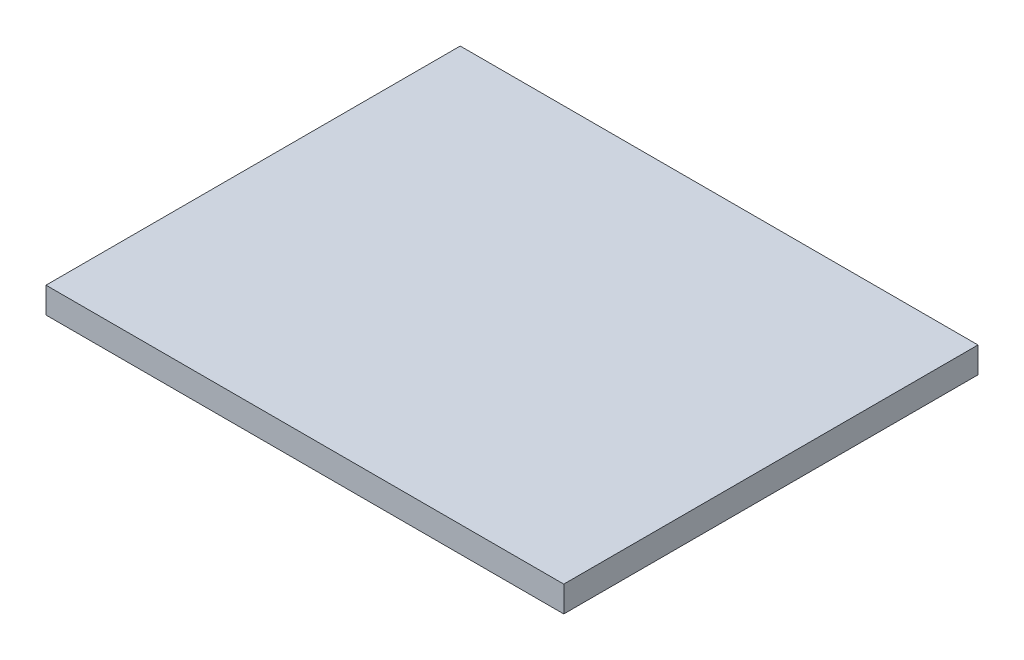
ISO-10303-21;
HEADER;
FILE_DESCRIPTION(('STEP AP214'),'2;1');
FILE_NAME('part.step','',(''),(''),'','','');
FILE_SCHEMA(('AUTOMOTIVE_DESIGN { 1 0 10303 214 1 1 1 1 }'));
ENDSEC;
DATA;
#1=APPLICATION_CONTEXT('core data for automotive mechanical design processes');
#2=APPLICATION_PROTOCOL_DEFINITION('international standard','automotive_design',2000,#1);
#3=PRODUCT_CONTEXT('',#1,'mechanical');
#4=PRODUCT('Part','Part','',(#3));
#5=PRODUCT_RELATED_PRODUCT_CATEGORY('part','',(#4));
#6=PRODUCT_DEFINITION_FORMATION('','',#4);
#7=PRODUCT_DEFINITION_CONTEXT('part definition',#1,'design');
#8=PRODUCT_DEFINITION('design','',#6,#7);
#9=PRODUCT_DEFINITION_SHAPE('','',#8);
#10=(LENGTH_UNIT() NAMED_UNIT(*) SI_UNIT(.MILLI.,.METRE.));
#11=(NAMED_UNIT(*) PLANE_ANGLE_UNIT() SI_UNIT($,.RADIAN.));
#12=(NAMED_UNIT(*) SI_UNIT($,.STERADIAN.) SOLID_ANGLE_UNIT());
#13=UNCERTAINTY_MEASURE_WITH_UNIT(LENGTH_MEASURE(1.E-05),#10,'distance_accuracy_value','');
#14=(GEOMETRIC_REPRESENTATION_CONTEXT(3) GLOBAL_UNCERTAINTY_ASSIGNED_CONTEXT((#13)) GLOBAL_UNIT_ASSIGNED_CONTEXT((#10,
#11,#12)) REPRESENTATION_CONTEXT('',''));
#15=CARTESIAN_POINT('',(0.,0.,0.));
#16=DIRECTION('',(0.,0.,1.));
#17=DIRECTION('',(1.,0.,0.));
#18=AXIS2_PLACEMENT_3D('',#15,#16,#17);
#19=CARTESIAN_POINT('',(-50.,5.,40.));
#20=DIRECTION('',(1.,0.,0.));
#21=DIRECTION('',(0.,0.,-1.));
#22=AXIS2_PLACEMENT_3D('',#19,#20,#21);
#23=PLANE('',#22);
#24=DIRECTION('',(0.,-1.,0.));
#25=VECTOR('',#24,1.);
#26=CARTESIAN_POINT('',(-50.,5.,-40.));
#27=LINE('',#26,#25);
#28=CARTESIAN_POINT('',(-50.,5.,-40.));
#29=VERTEX_POINT('',#28);
#30=CARTESIAN_POINT('',(-50.,0.,-40.));
#31=VERTEX_POINT('',#30);
#32=EDGE_CURVE('E102',#29,#31,#27,.T.);
#33=ORIENTED_EDGE('',*,*,#32,.T.);
#34=DIRECTION('',(0.,0.,-1.));
#35=VECTOR('',#34,1.);
#36=CARTESIAN_POINT('',(-50.,0.,40.));
#37=LINE('',#36,#35);
#38=CARTESIAN_POINT('',(-50.,0.,40.));
#39=VERTEX_POINT('',#38);
#40=EDGE_CURVE('E11',#39,#31,#37,.T.);
#41=ORIENTED_EDGE('',*,*,#40,.F.);
#42=DIRECTION('',(0.,-1.,0.));
#43=VECTOR('',#42,1.);
#44=CARTESIAN_POINT('',(-50.,5.,40.));
#45=LINE('',#44,#43);
#46=CARTESIAN_POINT('',(-50.,5.,40.));
#47=VERTEX_POINT('',#46);
#48=EDGE_CURVE('E90',#47,#39,#45,.T.);
#49=ORIENTED_EDGE('',*,*,#48,.F.);
#50=DIRECTION('',(0.,0.,-1.));
#51=VECTOR('',#50,1.);
#52=CARTESIAN_POINT('',(-50.,5.,40.));
#53=LINE('',#52,#51);
#54=EDGE_CURVE('E98',#47,#29,#53,.T.);
#55=ORIENTED_EDGE('',*,*,#54,.T.);
#56=EDGE_LOOP('',(#33,#41,#49,#55));
#57=FACE_BOUND('',#56,.T.);
#58=ADVANCED_FACE('F39',(#57),#23,.F.);
#59=CARTESIAN_POINT('',(-50.,0.,40.));
#60=DIRECTION('',(0.,1.,0.));
#61=DIRECTION('',(0.,0.,1.));
#62=AXIS2_PLACEMENT_3D('',#59,#60,#61);
#63=PLANE('',#62);
#64=DIRECTION('',(1.,0.,0.));
#65=VECTOR('',#64,1.);
#66=CARTESIAN_POINT('',(-50.,0.,-40.));
#67=LINE('',#66,#65);
#68=CARTESIAN_POINT('',(50.,0.,-40.));
#69=VERTEX_POINT('',#68);
#70=EDGE_CURVE('E94',#31,#69,#67,.T.);
#71=ORIENTED_EDGE('',*,*,#70,.T.);
#72=DIRECTION('',(0.,0.,-1.));
#73=VECTOR('',#72,1.);
#74=CARTESIAN_POINT('',(50.,0.,40.));
#75=LINE('',#74,#73);
#76=CARTESIAN_POINT('',(50.,0.,40.));
#77=VERTEX_POINT('',#76);
#78=EDGE_CURVE('E47',#77,#69,#75,.T.);
#79=ORIENTED_EDGE('',*,*,#78,.F.);
#80=DIRECTION('',(1.,0.,0.));
#81=VECTOR('',#80,1.);
#82=CARTESIAN_POINT('',(-50.,0.,40.));
#83=LINE('',#82,#81);
#84=EDGE_CURVE('E85',#39,#77,#83,.T.);
#85=ORIENTED_EDGE('',*,*,#84,.F.);
#86=ORIENTED_EDGE('',*,*,#40,.T.);
#87=EDGE_LOOP('',(#71,#79,#85,#86));
#88=FACE_BOUND('',#87,.T.);
#89=ADVANCED_FACE('F93',(#88),#63,.F.);
#90=CARTESIAN_POINT('',(50.,5.,40.));
#91=DIRECTION('',(-1.,0.,0.));
#92=DIRECTION('',(0.,0.,1.));
#93=AXIS2_PLACEMENT_3D('',#90,#91,#92);
#94=PLANE('',#93);
#95=DIRECTION('',(0.,1.,0.));
#96=VECTOR('',#95,1.);
#97=CARTESIAN_POINT('',(50.,5.,-40.));
#98=LINE('',#97,#96);
#99=CARTESIAN_POINT('',(50.,5.,-40.));
#100=VERTEX_POINT('',#99);
#101=EDGE_CURVE('E72',#69,#100,#98,.T.);
#102=ORIENTED_EDGE('',*,*,#101,.T.);
#103=DIRECTION('',(0.,0.,-1.));
#104=VECTOR('',#103,1.);
#105=CARTESIAN_POINT('',(50.,5.,40.));
#106=LINE('',#105,#104);
#107=CARTESIAN_POINT('',(50.,5.,40.));
#108=VERTEX_POINT('',#107);
#109=EDGE_CURVE('E95',#108,#100,#106,.T.);
#110=ORIENTED_EDGE('',*,*,#109,.F.);
#111=DIRECTION('',(0.,1.,0.));
#112=VECTOR('',#111,1.);
#113=CARTESIAN_POINT('',(50.,5.,40.));
#114=LINE('',#113,#112);
#115=EDGE_CURVE('E88',#77,#108,#114,.T.);
#116=ORIENTED_EDGE('',*,*,#115,.F.);
#117=ORIENTED_EDGE('',*,*,#78,.T.);
#118=EDGE_LOOP('',(#102,#110,#116,#117));
#119=FACE_BOUND('',#118,.T.);
#120=ADVANCED_FACE('F96',(#119),#94,.F.);
#121=CARTESIAN_POINT('',(-50.,5.,40.));
#122=DIRECTION('',(0.,-1.,0.));
#123=DIRECTION('',(0.,0.,-1.));
#124=AXIS2_PLACEMENT_3D('',#121,#122,#123);
#125=PLANE('',#124);
#126=DIRECTION('',(-1.,0.,0.));
#127=VECTOR('',#126,1.);
#128=CARTESIAN_POINT('',(-50.,5.,-40.));
#129=LINE('',#128,#127);
#130=EDGE_CURVE('E78',#100,#29,#129,.T.);
#131=ORIENTED_EDGE('',*,*,#130,.T.);
#132=ORIENTED_EDGE('',*,*,#54,.F.);
#133=DIRECTION('',(-1.,0.,0.));
#134=VECTOR('',#133,1.);
#135=CARTESIAN_POINT('',(-50.,5.,40.));
#136=LINE('',#135,#134);
#137=EDGE_CURVE('E55',#108,#47,#136,.T.);
#138=ORIENTED_EDGE('',*,*,#137,.F.);
#139=ORIENTED_EDGE('',*,*,#109,.T.);
#140=EDGE_LOOP('',(#131,#132,#138,#139));
#141=FACE_BOUND('',#140,.T.);
#142=ADVANCED_FACE('F109',(#141),#125,.F.);
#143=CARTESIAN_POINT('',(-50.,0.,40.));
#144=DIRECTION('',(0.,0.,1.));
#145=DIRECTION('',(1.,0.,0.));
#146=AXIS2_PLACEMENT_3D('',#143,#144,#145);
#147=PLANE('',#146);
#148=ORIENTED_EDGE('',*,*,#48,.T.);
#149=ORIENTED_EDGE('',*,*,#84,.T.);
#150=ORIENTED_EDGE('',*,*,#115,.T.);
#151=ORIENTED_EDGE('',*,*,#137,.T.);
#152=EDGE_LOOP('',(#148,#149,#150,#151));
#153=FACE_BOUND('',#152,.T.);
#154=ADVANCED_FACE('F86',(#153),#147,.T.);
#155=CARTESIAN_POINT('',(-50.,0.,-40.));
#156=DIRECTION('',(0.,0.,1.));
#157=DIRECTION('',(1.,0.,0.));
#158=AXIS2_PLACEMENT_3D('',#155,#156,#157);
#159=PLANE('',#158);
#160=ORIENTED_EDGE('',*,*,#32,.F.);
#161=ORIENTED_EDGE('',*,*,#130,.F.);
#162=ORIENTED_EDGE('',*,*,#101,.F.);
#163=ORIENTED_EDGE('',*,*,#70,.F.);
#164=EDGE_LOOP('',(#160,#161,#162,#163));
#165=FACE_BOUND('',#164,.T.);
#166=ADVANCED_FACE('F112',(#165),#159,.F.);
#167=CLOSED_SHELL('',(#58,#89,#120,#142,#154,#166));
#168=MANIFOLD_SOLID_BREP('B2',#167);
#169=ADVANCED_BREP_SHAPE_REPRESENTATION('',(#18,#168),#14);
#170=SHAPE_DEFINITION_REPRESENTATION(#9,#169);
ENDSEC;
END-ISO-10303-21;
